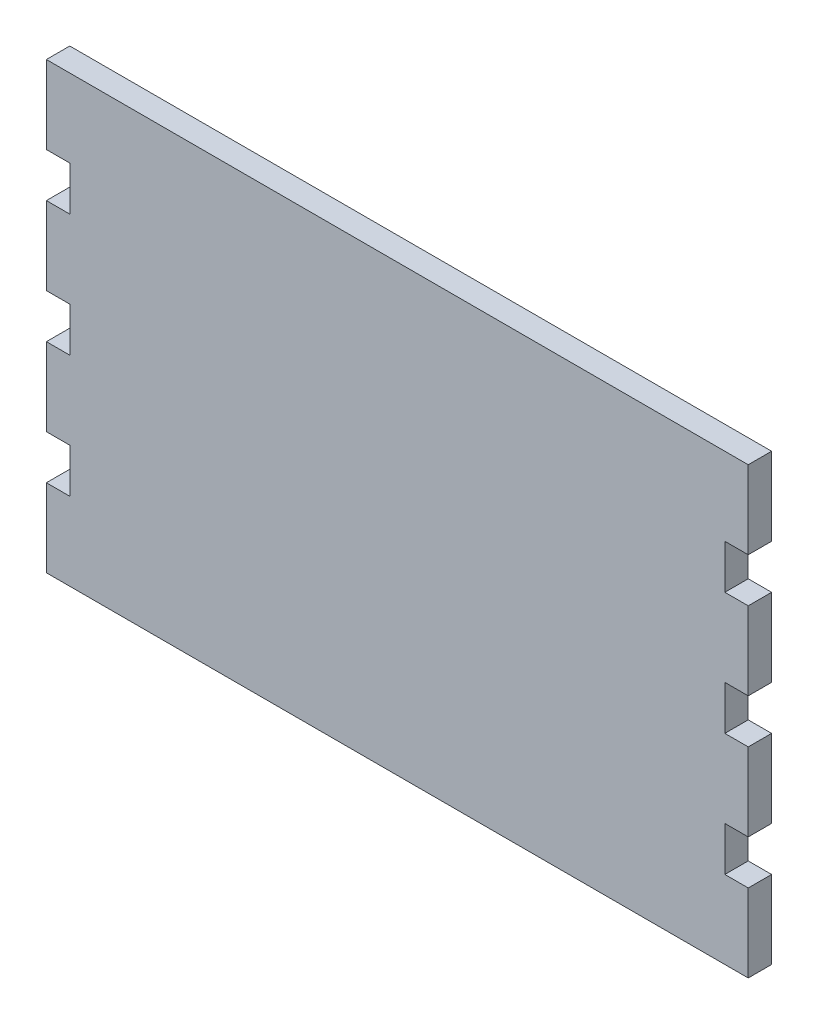
ISO-10303-21;
HEADER;
FILE_DESCRIPTION(('STEP AP214'),'2;1');
FILE_NAME('part.step','',(''),(''),'','','');
FILE_SCHEMA(('AUTOMOTIVE_DESIGN { 1 0 10303 214 1 1 1 1 }'));
ENDSEC;
DATA;
#1=APPLICATION_CONTEXT('core data for automotive mechanical design processes');
#2=APPLICATION_PROTOCOL_DEFINITION('international standard','automotive_design',2000,#1);
#3=PRODUCT_CONTEXT('',#1,'mechanical');
#4=PRODUCT('Part','Part','',(#3));
#5=PRODUCT_RELATED_PRODUCT_CATEGORY('part','',(#4));
#6=PRODUCT_DEFINITION_FORMATION('','',#4);
#7=PRODUCT_DEFINITION_CONTEXT('part definition',#1,'design');
#8=PRODUCT_DEFINITION('design','',#6,#7);
#9=PRODUCT_DEFINITION_SHAPE('','',#8);
#10=(LENGTH_UNIT() NAMED_UNIT(*) SI_UNIT(.MILLI.,.METRE.));
#11=(NAMED_UNIT(*) PLANE_ANGLE_UNIT() SI_UNIT($,.RADIAN.));
#12=(NAMED_UNIT(*) SI_UNIT($,.STERADIAN.) SOLID_ANGLE_UNIT());
#13=UNCERTAINTY_MEASURE_WITH_UNIT(LENGTH_MEASURE(1.E-05),#10,'distance_accuracy_value','');
#14=(GEOMETRIC_REPRESENTATION_CONTEXT(3) GLOBAL_UNCERTAINTY_ASSIGNED_CONTEXT((#13)) GLOBAL_UNIT_ASSIGNED_CONTEXT((#10,
#11,#12)) REPRESENTATION_CONTEXT('',''));
#15=CARTESIAN_POINT('',(0.,0.,0.));
#16=DIRECTION('',(0.,0.,1.));
#17=DIRECTION('',(1.,0.,0.));
#18=AXIS2_PLACEMENT_3D('',#15,#16,#17);
#19=CARTESIAN_POINT('',(0.,0.,-3.));
#20=DIRECTION('',(-1.,0.,0.));
#21=DIRECTION('',(0.,0.,1.));
#22=AXIS2_PLACEMENT_3D('',#19,#20,#21);
#23=PLANE('',#22);
#24=DIRECTION('',(0.,-1.,0.));
#25=VECTOR('',#24,1.);
#26=CARTESIAN_POINT('',(0.,0.,-3.));
#27=LINE('',#26,#25);
#28=CARTESIAN_POINT('',(0.,15.6666666666667,-3.));
#29=VERTEX_POINT('',#28);
#30=CARTESIAN_POINT('',(0.,10.,-3.));
#31=VERTEX_POINT('',#30);
#32=EDGE_CURVE('E269',#29,#31,#27,.T.);
#33=ORIENTED_EDGE('',*,*,#32,.T.);
#34=CARTESIAN_POINT('',(0.,10.,-3.));
#35=CARTESIAN_POINT('',(0.,10.,0.));
#36=B_SPLINE_CURVE_WITH_KNOTS('',1,(#34,#35),.UNSPECIFIED.,.F.,.F.,(2,2),(0.,0.115384615384615),.UNSPECIFIED.);
#37=CARTESIAN_POINT('',(0.,10.,0.));
#38=VERTEX_POINT('',#37);
#39=EDGE_CURVE('E274',#31,#38,#36,.T.);
#40=ORIENTED_EDGE('',*,*,#39,.T.);
#41=DIRECTION('',(0.,-1.,0.));
#42=VECTOR('',#41,1.);
#43=CARTESIAN_POINT('',(0.,0.,0.));
#44=LINE('',#43,#42);
#45=CARTESIAN_POINT('',(0.,15.6666666666667,0.));
#46=VERTEX_POINT('',#45);
#47=EDGE_CURVE('E306',#46,#38,#44,.T.);
#48=ORIENTED_EDGE('',*,*,#47,.F.);
#49=CARTESIAN_POINT('',(0.,15.6666666666667,0.));
#50=CARTESIAN_POINT('',(0.,15.6666666666667,-3.));
#51=B_SPLINE_CURVE_WITH_KNOTS('',1,(#49,#50),.UNSPECIFIED.,.F.,.F.,(2,2),(0.5,
0.615384615384615),.UNSPECIFIED.);
#52=EDGE_CURVE('E280',#46,#29,#51,.T.);
#53=ORIENTED_EDGE('',*,*,#52,.T.);
#54=EDGE_LOOP('',(#33,#40,#48,#53));
#55=FACE_BOUND('',#54,.T.);
#56=ADVANCED_FACE('F74',(#55),#23,.T.);
#57=CARTESIAN_POINT('',(0.,31.3333333333333,-3.));
#58=VERTEX_POINT('',#57);
#59=CARTESIAN_POINT('',(0.,25.6666666666667,-3.));
#60=VERTEX_POINT('',#59);
#61=EDGE_CURVE('E281',#58,#60,#27,.T.);
#62=ORIENTED_EDGE('',*,*,#61,.T.);
#63=CARTESIAN_POINT('',(0.,25.6666666666667,-3.));
#64=CARTESIAN_POINT('',(0.,25.6666666666667,0.));
#65=B_SPLINE_CURVE_WITH_KNOTS('',1,(#63,#64),.UNSPECIFIED.,.F.,.F.,(2,2),(0.,0.115384615384615),.UNSPECIFIED.);
#66=CARTESIAN_POINT('',(0.,25.6666666666667,0.));
#67=VERTEX_POINT('',#66);
#68=EDGE_CURVE('E462',#60,#67,#65,.T.);
#69=ORIENTED_EDGE('',*,*,#68,.T.);
#70=CARTESIAN_POINT('',(0.,31.3333333333333,0.));
#71=VERTEX_POINT('',#70);
#72=EDGE_CURVE('E305',#71,#67,#44,.T.);
#73=ORIENTED_EDGE('',*,*,#72,.F.);
#74=CARTESIAN_POINT('',(0.,31.3333333333333,0.));
#75=CARTESIAN_POINT('',(0.,31.3333333333333,-3.));
#76=B_SPLINE_CURVE_WITH_KNOTS('',1,(#74,#75),.UNSPECIFIED.,.F.,.F.,(2,2),(0.5,
0.615384615384615),.UNSPECIFIED.);
#77=EDGE_CURVE('E508',#71,#58,#76,.T.);
#78=ORIENTED_EDGE('',*,*,#77,.T.);
#79=EDGE_LOOP('',(#62,#69,#73,#78));
#80=FACE_BOUND('',#79,.T.);
#81=ADVANCED_FACE('F592',(#80),#23,.T.);
#82=CARTESIAN_POINT('',(0.,47.,-3.));
#83=VERTEX_POINT('',#82);
#84=CARTESIAN_POINT('',(0.,41.3333333333333,-3.));
#85=VERTEX_POINT('',#84);
#86=EDGE_CURVE('E283',#83,#85,#27,.T.);
#87=ORIENTED_EDGE('',*,*,#86,.T.);
#88=CARTESIAN_POINT('',(0.,41.3333333333333,-3.));
#89=CARTESIAN_POINT('',(0.,41.3333333333333,0.));
#90=B_SPLINE_CURVE_WITH_KNOTS('',1,(#88,#89),.UNSPECIFIED.,.F.,.F.,(2,2),(0.,0.115384615384615),.UNSPECIFIED.);
#91=CARTESIAN_POINT('',(0.,41.3333333333333,0.));
#92=VERTEX_POINT('',#91);
#93=EDGE_CURVE('E496',#85,#92,#90,.T.);
#94=ORIENTED_EDGE('',*,*,#93,.T.);
#95=CARTESIAN_POINT('',(0.,47.,0.));
#96=VERTEX_POINT('',#95);
#97=EDGE_CURVE('E301',#96,#92,#44,.T.);
#98=ORIENTED_EDGE('',*,*,#97,.F.);
#99=CARTESIAN_POINT('',(0.,47.,0.));
#100=CARTESIAN_POINT('',(0.,47.,-3.));
#101=B_SPLINE_CURVE_WITH_KNOTS('',1,(#99,#100),.UNSPECIFIED.,.F.,.F.,(2,2),(0.5,
0.615384615384615),.UNSPECIFIED.);
#102=EDGE_CURVE('E527',#96,#83,#101,.T.);
#103=ORIENTED_EDGE('',*,*,#102,.T.);
#104=EDGE_LOOP('',(#87,#94,#98,#103));
#105=FACE_BOUND('',#104,.T.);
#106=ADVANCED_FACE('F76',(#105),#23,.T.);
#107=CARTESIAN_POINT('',(84.,0.,-3.));
#108=DIRECTION('',(1.,0.,0.));
#109=DIRECTION('',(0.,0.,-1.));
#110=AXIS2_PLACEMENT_3D('',#107,#108,#109);
#111=PLANE('',#110);
#112=CARTESIAN_POINT('',(84.,47.,0.));
#113=CARTESIAN_POINT('',(84.,47.,-3.));
#114=B_SPLINE_CURVE_WITH_KNOTS('',1,(#112,#113),.UNSPECIFIED.,.F.,.F.,(2,2),(0.5,
0.615384615384615),.UNSPECIFIED.);
#115=CARTESIAN_POINT('',(84.,47.,0.));
#116=VERTEX_POINT('',#115);
#117=CARTESIAN_POINT('',(84.,47.,-3.));
#118=VERTEX_POINT('',#117);
#119=EDGE_CURVE('E330',#116,#118,#114,.T.);
#120=ORIENTED_EDGE('',*,*,#119,.F.);
#121=DIRECTION('',(0.,1.,0.));
#122=VECTOR('',#121,1.);
#123=CARTESIAN_POINT('',(84.,0.,0.));
#124=LINE('',#123,#122);
#125=CARTESIAN_POINT('',(84.,41.3333333333333,0.));
#126=VERTEX_POINT('',#125);
#127=EDGE_CURVE('E307',#126,#116,#124,.T.);
#128=ORIENTED_EDGE('',*,*,#127,.F.);
#129=CARTESIAN_POINT('',(84.,41.3333333333333,-3.));
#130=CARTESIAN_POINT('',(84.,41.3333333333333,0.));
#131=B_SPLINE_CURVE_WITH_KNOTS('',1,(#129,#130),.UNSPECIFIED.,.F.,.F.,(2,2),(0.,
0.115384615384615),.UNSPECIFIED.);
#132=CARTESIAN_POINT('',(84.,41.3333333333333,-3.));
#133=VERTEX_POINT('',#132);
#134=EDGE_CURVE('E353',#133,#126,#131,.T.);
#135=ORIENTED_EDGE('',*,*,#134,.F.);
#136=DIRECTION('',(0.,1.,0.));
#137=VECTOR('',#136,1.);
#138=CARTESIAN_POINT('',(84.,0.,-3.));
#139=LINE('',#138,#137);
#140=EDGE_CURVE('E293',#133,#118,#139,.T.);
#141=ORIENTED_EDGE('',*,*,#140,.T.);
#142=EDGE_LOOP('',(#120,#128,#135,#141));
#143=FACE_BOUND('',#142,.T.);
#144=ADVANCED_FACE('F617',(#143),#111,.T.);
#145=CARTESIAN_POINT('',(84.,31.3333333333333,0.));
#146=CARTESIAN_POINT('',(84.,31.3333333333333,-3.));
#147=B_SPLINE_CURVE_WITH_KNOTS('',1,(#145,#146),.UNSPECIFIED.,.F.,.F.,(2,2),(0.5,
0.615384615384615),.UNSPECIFIED.);
#148=CARTESIAN_POINT('',(84.,31.3333333333333,0.));
#149=VERTEX_POINT('',#148);
#150=CARTESIAN_POINT('',(84.,31.3333333333333,-3.));
#151=VERTEX_POINT('',#150);
#152=EDGE_CURVE('E346',#149,#151,#147,.T.);
#153=ORIENTED_EDGE('',*,*,#152,.F.);
#154=CARTESIAN_POINT('',(84.,25.6666666666667,0.));
#155=VERTEX_POINT('',#154);
#156=EDGE_CURVE('E309',#155,#149,#124,.T.);
#157=ORIENTED_EDGE('',*,*,#156,.F.);
#158=CARTESIAN_POINT('',(84.,25.6666666666667,-3.));
#159=CARTESIAN_POINT('',(84.,25.6666666666667,0.));
#160=B_SPLINE_CURVE_WITH_KNOTS('',1,(#158,#159),.UNSPECIFIED.,.F.,.F.,(2,2),(0.,
0.115384615384615),.UNSPECIFIED.);
#161=CARTESIAN_POINT('',(84.,25.6666666666667,-3.));
#162=VERTEX_POINT('',#161);
#163=EDGE_CURVE('E391',#162,#155,#160,.T.);
#164=ORIENTED_EDGE('',*,*,#163,.F.);
#165=EDGE_CURVE('E298',#162,#151,#139,.T.);
#166=ORIENTED_EDGE('',*,*,#165,.T.);
#167=EDGE_LOOP('',(#153,#157,#164,#166));
#168=FACE_BOUND('',#167,.T.);
#169=ADVANCED_FACE('F622',(#168),#111,.T.);
#170=CARTESIAN_POINT('',(0.,57.,-3.));
#171=DIRECTION('',(0.,1.,0.));
#172=DIRECTION('',(0.,0.,1.));
#173=AXIS2_PLACEMENT_3D('',#170,#171,#172);
#174=PLANE('',#173);
#175=DIRECTION('',(-1.,0.,0.));
#176=VECTOR('',#175,1.);
#177=CARTESIAN_POINT('',(0.,57.,0.));
#178=LINE('',#177,#176);
#179=CARTESIAN_POINT('',(87.,57.,0.));
#180=VERTEX_POINT('',#179);
#181=CARTESIAN_POINT('',(-2.99999999999948,57.,0.));
#182=VERTEX_POINT('',#181);
#183=EDGE_CURVE('E78',#180,#182,#178,.T.);
#184=ORIENTED_EDGE('',*,*,#183,.F.);
#185=DIRECTION('',(0.,0.,1.));
#186=VECTOR('',#185,1.);
#187=CARTESIAN_POINT('',(87.,57.,-3.));
#188=LINE('',#187,#186);
#189=CARTESIAN_POINT('',(87.,57.,-3.));
#190=VERTEX_POINT('',#189);
#191=EDGE_CURVE('E551',#190,#180,#188,.T.);
#192=ORIENTED_EDGE('',*,*,#191,.F.);
#193=DIRECTION('',(-1.,0.,0.));
#194=VECTOR('',#193,1.);
#195=CARTESIAN_POINT('',(0.,57.,-3.));
#196=LINE('',#195,#194);
#197=CARTESIAN_POINT('',(-2.99999999999949,57.,-3.));
#198=VERTEX_POINT('',#197);
#199=EDGE_CURVE('E13',#190,#198,#196,.T.);
#200=ORIENTED_EDGE('',*,*,#199,.T.);
#201=DIRECTION('',(0.,0.,-1.));
#202=VECTOR('',#201,1.);
#203=CARTESIAN_POINT('',(-2.99999999999949,57.,-3.00000000000001));
#204=LINE('',#203,#202);
#205=EDGE_CURVE('E338',#182,#198,#204,.T.);
#206=ORIENTED_EDGE('',*,*,#205,.F.);
#207=EDGE_LOOP('',(#184,#192,#200,#206));
#208=FACE_BOUND('',#207,.T.);
#209=ADVANCED_FACE('F563',(#208),#174,.T.);
#210=CARTESIAN_POINT('',(84.,15.6666666666667,0.));
#211=CARTESIAN_POINT('',(84.,15.6666666666667,-3.));
#212=B_SPLINE_CURVE_WITH_KNOTS('',1,(#210,#211),.UNSPECIFIED.,.F.,.F.,(2,2),(0.5,
0.615384615384615),.UNSPECIFIED.);
#213=CARTESIAN_POINT('',(84.,15.6666666666667,0.));
#214=VERTEX_POINT('',#213);
#215=CARTESIAN_POINT('',(84.,15.6666666666667,-3.));
#216=VERTEX_POINT('',#215);
#217=EDGE_CURVE('E384',#214,#216,#212,.T.);
#218=ORIENTED_EDGE('',*,*,#217,.F.);
#219=CARTESIAN_POINT('',(84.,10.,0.));
#220=VERTEX_POINT('',#219);
#221=EDGE_CURVE('E285',#220,#214,#124,.T.);
#222=ORIENTED_EDGE('',*,*,#221,.F.);
#223=CARTESIAN_POINT('',(84.,10.,-3.));
#224=CARTESIAN_POINT('',(84.,10.,0.));
#225=B_SPLINE_CURVE_WITH_KNOTS('',1,(#223,#224),.UNSPECIFIED.,.F.,.F.,(2,2),(0.,
0.115384615384615),.UNSPECIFIED.);
#226=CARTESIAN_POINT('',(84.,10.,-3.));
#227=VERTEX_POINT('',#226);
#228=EDGE_CURVE('E423',#227,#220,#225,.T.);
#229=ORIENTED_EDGE('',*,*,#228,.F.);
#230=EDGE_CURVE('E83',#227,#216,#139,.T.);
#231=ORIENTED_EDGE('',*,*,#230,.T.);
#232=EDGE_LOOP('',(#218,#222,#229,#231));
#233=FACE_BOUND('',#232,.T.);
#234=ADVANCED_FACE('F452',(#233),#111,.T.);
#235=CARTESIAN_POINT('',(0.,0.,-3.));
#236=DIRECTION('',(0.,-1.,0.));
#237=DIRECTION('',(0.,0.,-1.));
#238=AXIS2_PLACEMENT_3D('',#235,#236,#237);
#239=PLANE('',#238);
#240=DIRECTION('',(1.,0.,0.));
#241=VECTOR('',#240,1.);
#242=CARTESIAN_POINT('',(0.,0.,0.));
#243=LINE('',#242,#241);
#244=CARTESIAN_POINT('',(-2.99999999999984,0.,0.));
#245=VERTEX_POINT('',#244);
#246=CARTESIAN_POINT('',(87.,0.,0.));
#247=VERTEX_POINT('',#246);
#248=EDGE_CURVE('E304',#245,#247,#243,.T.);
#249=ORIENTED_EDGE('',*,*,#248,.F.);
#250=DIRECTION('',(0.,0.,1.));
#251=VECTOR('',#250,1.);
#252=CARTESIAN_POINT('',(-2.99999999999988,0.,0.));
#253=LINE('',#252,#251);
#254=CARTESIAN_POINT('',(-2.99999999999989,0.,-3.));
#255=VERTEX_POINT('',#254);
#256=EDGE_CURVE('E272',#255,#245,#253,.T.);
#257=ORIENTED_EDGE('',*,*,#256,.F.);
#258=DIRECTION('',(1.,0.,0.));
#259=VECTOR('',#258,1.);
#260=CARTESIAN_POINT('',(0.,0.,-3.));
#261=LINE('',#260,#259);
#262=CARTESIAN_POINT('',(87.,0.,-3.));
#263=VERTEX_POINT('',#262);
#264=EDGE_CURVE('E289',#255,#263,#261,.T.);
#265=ORIENTED_EDGE('',*,*,#264,.T.);
#266=DIRECTION('',(0.,0.,-1.));
#267=VECTOR('',#266,1.);
#268=CARTESIAN_POINT('',(87.,0.,0.));
#269=LINE('',#268,#267);
#270=EDGE_CURVE('E429',#247,#263,#269,.T.);
#271=ORIENTED_EDGE('',*,*,#270,.F.);
#272=EDGE_LOOP('',(#249,#257,#265,#271));
#273=FACE_BOUND('',#272,.T.);
#274=ADVANCED_FACE('F455',(#273),#239,.T.);
#275=CARTESIAN_POINT('',(0.,0.,-3.));
#276=DIRECTION('',(0.,0.,-1.));
#277=DIRECTION('',(-1.,0.,0.));
#278=AXIS2_PLACEMENT_3D('',#275,#276,#277);
#279=PLANE('',#278);
#280=ORIENTED_EDGE('',*,*,#86,.F.);
#281=DIRECTION('',(1.,0.,0.));
#282=VECTOR('',#281,1.);
#283=CARTESIAN_POINT('',(-5.99999999999901,47.,-3.));
#284=LINE('',#283,#282);
#285=CARTESIAN_POINT('',(-2.99999999999956,47.,-3.));
#286=VERTEX_POINT('',#285);
#287=EDGE_CURVE('E531',#286,#83,#284,.T.);
#288=ORIENTED_EDGE('',*,*,#287,.F.);
#289=DIRECTION('',(0.,-1.,0.));
#290=VECTOR('',#289,1.);
#291=CARTESIAN_POINT('',(-2.99999999999956,47.,-3.));
#292=LINE('',#291,#290);
#293=EDGE_CURVE('E530',#198,#286,#292,.T.);
#294=ORIENTED_EDGE('',*,*,#293,.F.);
#295=ORIENTED_EDGE('',*,*,#199,.F.);
#296=DIRECTION('',(0.,1.,0.));
#297=VECTOR('',#296,1.);
#298=CARTESIAN_POINT('',(87.,47.,-3.));
#299=LINE('',#298,#297);
#300=CARTESIAN_POINT('',(87.,47.,-3.));
#301=VERTEX_POINT('',#300);
#302=EDGE_CURVE('E342',#301,#190,#299,.T.);
#303=ORIENTED_EDGE('',*,*,#302,.F.);
#304=DIRECTION('',(-1.,0.,0.));
#305=VECTOR('',#304,1.);
#306=CARTESIAN_POINT('',(90.,47.,-3.));
#307=LINE('',#306,#305);
#308=EDGE_CURVE('E335',#301,#118,#307,.T.);
#309=ORIENTED_EDGE('',*,*,#308,.T.);
#310=ORIENTED_EDGE('',*,*,#140,.F.);
#311=DIRECTION('',(-1.,0.,0.));
#312=VECTOR('',#311,1.);
#313=CARTESIAN_POINT('',(90.,41.3333333333333,-3.));
#314=LINE('',#313,#312);
#315=CARTESIAN_POINT('',(87.,41.3333333333333,-3.));
#316=VERTEX_POINT('',#315);
#317=EDGE_CURVE('E360',#316,#133,#314,.T.);
#318=ORIENTED_EDGE('',*,*,#317,.F.);
#319=DIRECTION('',(0.,1.,0.));
#320=VECTOR('',#319,1.);
#321=CARTESIAN_POINT('',(87.,31.3333333333333,-3.));
#322=LINE('',#321,#320);
#323=CARTESIAN_POINT('',(87.,31.3333333333333,-3.));
#324=VERTEX_POINT('',#323);
#325=EDGE_CURVE('E374',#324,#316,#322,.T.);
#326=ORIENTED_EDGE('',*,*,#325,.F.);
#327=DIRECTION('',(-1.,0.,0.));
#328=VECTOR('',#327,1.);
#329=CARTESIAN_POINT('',(90.,31.3333333333333,-3.));
#330=LINE('',#329,#328);
#331=EDGE_CURVE('E351',#324,#151,#330,.T.);
#332=ORIENTED_EDGE('',*,*,#331,.T.);
#333=ORIENTED_EDGE('',*,*,#165,.F.);
#334=DIRECTION('',(-1.,0.,0.));
#335=VECTOR('',#334,1.);
#336=CARTESIAN_POINT('',(90.,25.6666666666667,-3.));
#337=LINE('',#336,#335);
#338=CARTESIAN_POINT('',(87.,25.6666666666667,-3.));
#339=VERTEX_POINT('',#338);
#340=EDGE_CURVE('E367',#339,#162,#337,.T.);
#341=ORIENTED_EDGE('',*,*,#340,.F.);
#342=DIRECTION('',(0.,1.,0.));
#343=VECTOR('',#342,1.);
#344=CARTESIAN_POINT('',(87.,15.6666666666667,-3.));
#345=LINE('',#344,#343);
#346=CARTESIAN_POINT('',(87.,15.6666666666667,-3.));
#347=VERTEX_POINT('',#346);
#348=EDGE_CURVE('E413',#347,#339,#345,.T.);
#349=ORIENTED_EDGE('',*,*,#348,.F.);
#350=DIRECTION('',(-1.,0.,0.));
#351=VECTOR('',#350,1.);
#352=CARTESIAN_POINT('',(90.,15.6666666666667,-3.));
#353=LINE('',#352,#351);
#354=EDGE_CURVE('E389',#347,#216,#353,.T.);
#355=ORIENTED_EDGE('',*,*,#354,.T.);
#356=ORIENTED_EDGE('',*,*,#230,.F.);
#357=DIRECTION('',(-1.,0.,0.));
#358=VECTOR('',#357,1.);
#359=CARTESIAN_POINT('',(90.,10.,-3.));
#360=LINE('',#359,#358);
#361=CARTESIAN_POINT('',(87.,10.,-3.));
#362=VERTEX_POINT('',#361);
#363=EDGE_CURVE('E406',#362,#227,#360,.T.);
#364=ORIENTED_EDGE('',*,*,#363,.F.);
#365=DIRECTION('',(0.,1.,0.));
#366=VECTOR('',#365,1.);
#367=CARTESIAN_POINT('',(87.,0.,-3.));
#368=LINE('',#367,#366);
#369=EDGE_CURVE('E441',#263,#362,#368,.T.);
#370=ORIENTED_EDGE('',*,*,#369,.F.);
#371=ORIENTED_EDGE('',*,*,#264,.F.);
#372=DIRECTION('',(0.,-1.,0.));
#373=VECTOR('',#372,1.);
#374=CARTESIAN_POINT('',(-2.99999999999989,0.,-3.));
#375=LINE('',#374,#373);
#376=CARTESIAN_POINT('',(-2.99999999999982,10.,-3.));
#377=VERTEX_POINT('',#376);
#378=EDGE_CURVE('E271',#377,#255,#375,.T.);
#379=ORIENTED_EDGE('',*,*,#378,.F.);
#380=DIRECTION('',(1.,0.,0.));
#381=VECTOR('',#380,1.);
#382=CARTESIAN_POINT('',(-5.99999999999967,10.,-3.));
#383=LINE('',#382,#381);
#384=EDGE_CURVE('E265',#377,#31,#383,.T.);
#385=ORIENTED_EDGE('',*,*,#384,.T.);
#386=ORIENTED_EDGE('',*,*,#32,.F.);
#387=DIRECTION('',(1.,0.,0.));
#388=VECTOR('',#387,1.);
#389=CARTESIAN_POINT('',(-5.99999999999945,15.6666666666667,-3.));
#390=LINE('',#389,#388);
#391=CARTESIAN_POINT('',(-2.99999999999978,15.6666666666667,-3.));
#392=VERTEX_POINT('',#391);
#393=EDGE_CURVE('E99',#392,#29,#390,.T.);
#394=ORIENTED_EDGE('',*,*,#393,.F.);
#395=DIRECTION('',(0.,-1.,0.));
#396=VECTOR('',#395,1.);
#397=CARTESIAN_POINT('',(-2.99999999999978,15.6666666666667,-3.));
#398=LINE('',#397,#396);
#399=CARTESIAN_POINT('',(-2.99999999999971,25.6666666666667,-3.));
#400=VERTEX_POINT('',#399);
#401=EDGE_CURVE('E472',#400,#392,#398,.T.);
#402=ORIENTED_EDGE('',*,*,#401,.F.);
#403=DIRECTION('',(1.,0.,0.));
#404=VECTOR('',#403,1.);
#405=CARTESIAN_POINT('',(-5.99999999999945,25.6666666666667,-3.));
#406=LINE('',#405,#404);
#407=EDGE_CURVE('E473',#400,#60,#406,.T.);
#408=ORIENTED_EDGE('',*,*,#407,.T.);
#409=ORIENTED_EDGE('',*,*,#61,.F.);
#410=DIRECTION('',(1.,0.,0.));
#411=VECTOR('',#410,1.);
#412=CARTESIAN_POINT('',(-5.99999999999923,31.3333333333333,-3.));
#413=LINE('',#412,#411);
#414=CARTESIAN_POINT('',(-2.99999999999967,31.3333333333333,-3.));
#415=VERTEX_POINT('',#414);
#416=EDGE_CURVE('E521',#415,#58,#413,.T.);
#417=ORIENTED_EDGE('',*,*,#416,.F.);
#418=DIRECTION('',(0.,-1.,0.));
#419=VECTOR('',#418,1.);
#420=CARTESIAN_POINT('',(-2.99999999999967,31.3333333333333,-3.));
#421=LINE('',#420,#419);
#422=CARTESIAN_POINT('',(-2.9999999999996,41.3333333333333,-3.));
#423=VERTEX_POINT('',#422);
#424=EDGE_CURVE('E499',#423,#415,#421,.T.);
#425=ORIENTED_EDGE('',*,*,#424,.F.);
#426=DIRECTION('',(1.,0.,0.));
#427=VECTOR('',#426,1.);
#428=CARTESIAN_POINT('',(-5.99999999999923,41.3333333333333,-3.));
#429=LINE('',#428,#427);
#430=EDGE_CURVE('E500',#423,#85,#429,.T.);
#431=ORIENTED_EDGE('',*,*,#430,.T.);
#432=EDGE_LOOP('',(#280,#288,#294,#295,#303,#309,#310,#318,#326,#332,#333,#341,#349,#355,#356,
#364,#370,#371,#379,#385,#386,#394,#402,#408,#409,#417,#425,#431));
#433=FACE_BOUND('',#432,.T.);
#434=ADVANCED_FACE('F267',(#433),#279,.T.);
#435=CARTESIAN_POINT('',(0.,0.,0.));
#436=DIRECTION('',(0.,0.,-1.));
#437=DIRECTION('',(-1.,0.,0.));
#438=AXIS2_PLACEMENT_3D('',#435,#436,#437);
#439=PLANE('',#438);
#440=ORIENTED_EDGE('',*,*,#183,.T.);
#441=DIRECTION('',(0.,1.,0.));
#442=VECTOR('',#441,1.);
#443=CARTESIAN_POINT('',(-2.99999999999948,57.,0.));
#444=LINE('',#443,#442);
#445=CARTESIAN_POINT('',(-2.99999999999951,47.,0.));
#446=VERTEX_POINT('',#445);
#447=EDGE_CURVE('E333',#446,#182,#444,.T.);
#448=ORIENTED_EDGE('',*,*,#447,.F.);
#449=DIRECTION('',(1.,0.,0.));
#450=VECTOR('',#449,1.);
#451=CARTESIAN_POINT('',(-5.99999999999901,47.,0.));
#452=LINE('',#451,#450);
#453=EDGE_CURVE('E538',#446,#96,#452,.T.);
#454=ORIENTED_EDGE('',*,*,#453,.T.);
#455=ORIENTED_EDGE('',*,*,#97,.T.);
#456=DIRECTION('',(1.,0.,0.));
#457=VECTOR('',#456,1.);
#458=CARTESIAN_POINT('',(-5.99999999999923,41.3333333333333,0.));
#459=LINE('',#458,#457);
#460=CARTESIAN_POINT('',(-2.99999999999959,41.3333333333333,0.));
#461=VERTEX_POINT('',#460);
#462=EDGE_CURVE('E516',#461,#92,#459,.T.);
#463=ORIENTED_EDGE('',*,*,#462,.F.);
#464=DIRECTION('',(0.,1.,0.));
#465=VECTOR('',#464,1.);
#466=CARTESIAN_POINT('',(-2.99999999999959,41.3333333333333,0.));
#467=LINE('',#466,#465);
#468=CARTESIAN_POINT('',(-2.99999999999962,31.3333333333333,0.));
#469=VERTEX_POINT('',#468);
#470=EDGE_CURVE('E504',#469,#461,#467,.T.);
#471=ORIENTED_EDGE('',*,*,#470,.F.);
#472=DIRECTION('',(1.,0.,0.));
#473=VECTOR('',#472,1.);
#474=CARTESIAN_POINT('',(-5.99999999999923,31.3333333333333,0.));
#475=LINE('',#474,#473);
#476=EDGE_CURVE('E523',#469,#71,#475,.T.);
#477=ORIENTED_EDGE('',*,*,#476,.T.);
#478=ORIENTED_EDGE('',*,*,#72,.T.);
#479=DIRECTION('',(1.,0.,0.));
#480=VECTOR('',#479,1.);
#481=CARTESIAN_POINT('',(-5.99999999999945,25.6666666666667,0.));
#482=LINE('',#481,#480);
#483=CARTESIAN_POINT('',(-2.9999999999997,25.6666666666667,0.));
#484=VERTEX_POINT('',#483);
#485=EDGE_CURVE('E486',#484,#67,#482,.T.);
#486=ORIENTED_EDGE('',*,*,#485,.F.);
#487=DIRECTION('',(0.,1.,0.));
#488=VECTOR('',#487,1.);
#489=CARTESIAN_POINT('',(-2.9999999999997,25.6666666666667,0.));
#490=LINE('',#489,#488);
#491=CARTESIAN_POINT('',(-2.99999999999973,15.6666666666667,0.));
#492=VERTEX_POINT('',#491);
#493=EDGE_CURVE('E476',#492,#484,#490,.T.);
#494=ORIENTED_EDGE('',*,*,#493,.F.);
#495=DIRECTION('',(1.,0.,0.));
#496=VECTOR('',#495,1.);
#497=CARTESIAN_POINT('',(-5.99999999999945,15.6666666666667,0.));
#498=LINE('',#497,#496);
#499=EDGE_CURVE('E492',#492,#46,#498,.T.);
#500=ORIENTED_EDGE('',*,*,#499,.T.);
#501=ORIENTED_EDGE('',*,*,#47,.T.);
#502=DIRECTION('',(1.,0.,0.));
#503=VECTOR('',#502,1.);
#504=CARTESIAN_POINT('',(-5.99999999999967,10.,0.));
#505=LINE('',#504,#503);
#506=CARTESIAN_POINT('',(-2.99999999999981,10.,0.));
#507=VERTEX_POINT('',#506);
#508=EDGE_CURVE('E91',#507,#38,#505,.T.);
#509=ORIENTED_EDGE('',*,*,#508,.F.);
#510=DIRECTION('',(0.,1.,0.));
#511=VECTOR('',#510,1.);
#512=CARTESIAN_POINT('',(-2.99999999999981,9.99999999999999,0.));
#513=LINE('',#512,#511);
#514=EDGE_CURVE('E460',#245,#507,#513,.T.);
#515=ORIENTED_EDGE('',*,*,#514,.F.);
#516=ORIENTED_EDGE('',*,*,#248,.T.);
#517=DIRECTION('',(0.,-1.,0.));
#518=VECTOR('',#517,1.);
#519=CARTESIAN_POINT('',(87.,10.,0.));
#520=LINE('',#519,#518);
#521=CARTESIAN_POINT('',(87.,10.,0.));
#522=VERTEX_POINT('',#521);
#523=EDGE_CURVE('E435',#522,#247,#520,.T.);
#524=ORIENTED_EDGE('',*,*,#523,.F.);
#525=DIRECTION('',(-1.,0.,0.));
#526=VECTOR('',#525,1.);
#527=CARTESIAN_POINT('',(90.,10.,0.));
#528=LINE('',#527,#526);
#529=EDGE_CURVE('E428',#522,#220,#528,.T.);
#530=ORIENTED_EDGE('',*,*,#529,.T.);
#531=ORIENTED_EDGE('',*,*,#221,.T.);
#532=DIRECTION('',(-1.,0.,0.));
#533=VECTOR('',#532,1.);
#534=CARTESIAN_POINT('',(90.,15.6666666666667,0.));
#535=LINE('',#534,#533);
#536=CARTESIAN_POINT('',(87.,15.6666666666667,0.));
#537=VERTEX_POINT('',#536);
#538=EDGE_CURVE('E390',#537,#214,#535,.T.);
#539=ORIENTED_EDGE('',*,*,#538,.F.);
#540=DIRECTION('',(0.,-1.,0.));
#541=VECTOR('',#540,1.);
#542=CARTESIAN_POINT('',(87.,25.6666666666667,0.));
#543=LINE('',#542,#541);
#544=CARTESIAN_POINT('',(87.,25.6666666666667,0.));
#545=VERTEX_POINT('',#544);
#546=EDGE_CURVE('E407',#545,#537,#543,.T.);
#547=ORIENTED_EDGE('',*,*,#546,.F.);
#548=DIRECTION('',(-1.,0.,0.));
#549=VECTOR('',#548,1.);
#550=CARTESIAN_POINT('',(90.,25.6666666666667,0.));
#551=LINE('',#550,#549);
#552=EDGE_CURVE('E399',#545,#155,#551,.T.);
#553=ORIENTED_EDGE('',*,*,#552,.T.);
#554=ORIENTED_EDGE('',*,*,#156,.T.);
#555=DIRECTION('',(-1.,0.,0.));
#556=VECTOR('',#555,1.);
#557=CARTESIAN_POINT('',(90.,31.3333333333333,0.));
#558=LINE('',#557,#556);
#559=CARTESIAN_POINT('',(87.,31.3333333333333,0.));
#560=VERTEX_POINT('',#559);
#561=EDGE_CURVE('E352',#560,#149,#558,.T.);
#562=ORIENTED_EDGE('',*,*,#561,.F.);
#563=DIRECTION('',(0.,-1.,0.));
#564=VECTOR('',#563,1.);
#565=CARTESIAN_POINT('',(87.,41.3333333333333,0.));
#566=LINE('',#565,#564);
#567=CARTESIAN_POINT('',(87.,41.3333333333333,0.));
#568=VERTEX_POINT('',#567);
#569=EDGE_CURVE('E368',#568,#560,#566,.T.);
#570=ORIENTED_EDGE('',*,*,#569,.F.);
#571=DIRECTION('',(-1.,0.,0.));
#572=VECTOR('',#571,1.);
#573=CARTESIAN_POINT('',(90.,41.3333333333333,0.));
#574=LINE('',#573,#572);
#575=EDGE_CURVE('E324',#568,#126,#574,.T.);
#576=ORIENTED_EDGE('',*,*,#575,.T.);
#577=ORIENTED_EDGE('',*,*,#127,.T.);
#578=DIRECTION('',(-1.,0.,0.));
#579=VECTOR('',#578,1.);
#580=CARTESIAN_POINT('',(90.,47.,0.));
#581=LINE('',#580,#579);
#582=CARTESIAN_POINT('',(87.,47.,0.));
#583=VERTEX_POINT('',#582);
#584=EDGE_CURVE('E321',#583,#116,#581,.T.);
#585=ORIENTED_EDGE('',*,*,#584,.F.);
#586=DIRECTION('',(0.,-1.,0.));
#587=VECTOR('',#586,1.);
#588=CARTESIAN_POINT('',(87.,57.,0.));
#589=LINE('',#588,#587);
#590=EDGE_CURVE('E550',#180,#583,#589,.T.);
#591=ORIENTED_EDGE('',*,*,#590,.F.);
#592=EDGE_LOOP('',(#440,#448,#454,#455,#463,#471,#477,#478,#486,#494,#500,#501,#509,#515,#516,
#524,#530,#531,#539,#547,#553,#554,#562,#570,#576,#577,#585,#591));
#593=FACE_BOUND('',#592,.T.);
#594=ADVANCED_FACE('F319',(#593),#439,.F.);
#595=CARTESIAN_POINT('',(90.,10.,-3.));
#596=DIRECTION('',(0.,-1.,0.));
#597=DIRECTION('',(0.,0.,-1.));
#598=AXIS2_PLACEMENT_3D('',#595,#596,#597);
#599=PLANE('',#598);
#600=DIRECTION('',(0.,0.,1.));
#601=VECTOR('',#600,1.);
#602=CARTESIAN_POINT('',(87.,10.,-3.));
#603=LINE('',#602,#601);
#604=EDGE_CURVE('E438',#362,#522,#603,.T.);
#605=ORIENTED_EDGE('',*,*,#604,.F.);
#606=ORIENTED_EDGE('',*,*,#363,.T.);
#607=ORIENTED_EDGE('',*,*,#228,.T.);
#608=ORIENTED_EDGE('',*,*,#529,.F.);
#609=EDGE_LOOP('',(#605,#606,#607,#608));
#610=FACE_BOUND('',#609,.T.);
#611=ADVANCED_FACE('F447',(#610),#599,.F.);
#612=CARTESIAN_POINT('',(87.,57.0000000000003,-27.0000000000001));
#613=DIRECTION('',(1.,0.,0.));
#614=DIRECTION('',(0.,1.,0.));
#615=AXIS2_PLACEMENT_3D('',#612,#613,#614);
#616=PLANE('',#615);
#617=ORIENTED_EDGE('',*,*,#369,.T.);
#618=ORIENTED_EDGE('',*,*,#604,.T.);
#619=ORIENTED_EDGE('',*,*,#523,.T.);
#620=ORIENTED_EDGE('',*,*,#270,.T.);
#621=EDGE_LOOP('',(#617,#618,#619,#620));
#622=FACE_BOUND('',#621,.T.);
#623=ADVANCED_FACE('F454',(#622),#616,.T.);
#624=CARTESIAN_POINT('',(90.,25.6666666666667,-3.));
#625=DIRECTION('',(0.,-1.,0.));
#626=DIRECTION('',(0.,0.,-1.));
#627=AXIS2_PLACEMENT_3D('',#624,#625,#626);
#628=PLANE('',#627);
#629=DIRECTION('',(0.,0.,1.));
#630=VECTOR('',#629,1.);
#631=CARTESIAN_POINT('',(87.,25.6666666666667,-3.));
#632=LINE('',#631,#630);
#633=EDGE_CURVE('E410',#339,#545,#632,.T.);
#634=ORIENTED_EDGE('',*,*,#633,.F.);
#635=ORIENTED_EDGE('',*,*,#340,.T.);
#636=ORIENTED_EDGE('',*,*,#163,.T.);
#637=ORIENTED_EDGE('',*,*,#552,.F.);
#638=EDGE_LOOP('',(#634,#635,#636,#637));
#639=FACE_BOUND('',#638,.T.);
#640=ADVANCED_FACE('F643',(#639),#628,.F.);
#641=CARTESIAN_POINT('',(90.,15.6666666666667,0.));
#642=DIRECTION('',(0.,1.,0.));
#643=DIRECTION('',(0.,0.,1.));
#644=AXIS2_PLACEMENT_3D('',#641,#642,#643);
#645=PLANE('',#644);
#646=DIRECTION('',(0.,0.,-1.));
#647=VECTOR('',#646,1.);
#648=CARTESIAN_POINT('',(87.,15.6666666666667,0.));
#649=LINE('',#648,#647);
#650=EDGE_CURVE('E400',#537,#347,#649,.T.);
#651=ORIENTED_EDGE('',*,*,#650,.F.);
#652=ORIENTED_EDGE('',*,*,#538,.T.);
#653=ORIENTED_EDGE('',*,*,#217,.T.);
#654=ORIENTED_EDGE('',*,*,#354,.F.);
#655=EDGE_LOOP('',(#651,#652,#653,#654));
#656=FACE_BOUND('',#655,.T.);
#657=ADVANCED_FACE('F650',(#656),#645,.F.);
#658=CARTESIAN_POINT('',(87.,57.0000000000003,-27.0000000000001));
#659=DIRECTION('',(1.,0.,0.));
#660=DIRECTION('',(0.,1.,0.));
#661=AXIS2_PLACEMENT_3D('',#658,#659,#660);
#662=PLANE('',#661);
#663=ORIENTED_EDGE('',*,*,#348,.T.);
#664=ORIENTED_EDGE('',*,*,#633,.T.);
#665=ORIENTED_EDGE('',*,*,#546,.T.);
#666=ORIENTED_EDGE('',*,*,#650,.T.);
#667=EDGE_LOOP('',(#663,#664,#665,#666));
#668=FACE_BOUND('',#667,.T.);
#669=ADVANCED_FACE('F646',(#668),#662,.T.);
#670=CARTESIAN_POINT('',(90.,41.3333333333333,-3.));
#671=DIRECTION('',(0.,-1.,0.));
#672=DIRECTION('',(0.,0.,-1.));
#673=AXIS2_PLACEMENT_3D('',#670,#671,#672);
#674=PLANE('',#673);
#675=DIRECTION('',(0.,0.,1.));
#676=VECTOR('',#675,1.);
#677=CARTESIAN_POINT('',(87.,41.3333333333333,-3.));
#678=LINE('',#677,#676);
#679=EDGE_CURVE('E371',#316,#568,#678,.T.);
#680=ORIENTED_EDGE('',*,*,#679,.F.);
#681=ORIENTED_EDGE('',*,*,#317,.T.);
#682=ORIENTED_EDGE('',*,*,#134,.T.);
#683=ORIENTED_EDGE('',*,*,#575,.F.);
#684=EDGE_LOOP('',(#680,#681,#682,#683));
#685=FACE_BOUND('',#684,.T.);
#686=ADVANCED_FACE('F649',(#685),#674,.F.);
#687=CARTESIAN_POINT('',(90.,31.3333333333333,0.));
#688=DIRECTION('',(0.,1.,0.));
#689=DIRECTION('',(0.,0.,1.));
#690=AXIS2_PLACEMENT_3D('',#687,#688,#689);
#691=PLANE('',#690);
#692=DIRECTION('',(0.,0.,-1.));
#693=VECTOR('',#692,1.);
#694=CARTESIAN_POINT('',(87.,31.3333333333333,0.));
#695=LINE('',#694,#693);
#696=EDGE_CURVE('E361',#560,#324,#695,.T.);
#697=ORIENTED_EDGE('',*,*,#696,.F.);
#698=ORIENTED_EDGE('',*,*,#561,.T.);
#699=ORIENTED_EDGE('',*,*,#152,.T.);
#700=ORIENTED_EDGE('',*,*,#331,.F.);
#701=EDGE_LOOP('',(#697,#698,#699,#700));
#702=FACE_BOUND('',#701,.T.);
#703=ADVANCED_FACE('F661',(#702),#691,.F.);
#704=CARTESIAN_POINT('',(87.,57.0000000000003,-27.0000000000001));
#705=DIRECTION('',(1.,0.,0.));
#706=DIRECTION('',(0.,1.,0.));
#707=AXIS2_PLACEMENT_3D('',#704,#705,#706);
#708=PLANE('',#707);
#709=ORIENTED_EDGE('',*,*,#325,.T.);
#710=ORIENTED_EDGE('',*,*,#679,.T.);
#711=ORIENTED_EDGE('',*,*,#569,.T.);
#712=ORIENTED_EDGE('',*,*,#696,.T.);
#713=EDGE_LOOP('',(#709,#710,#711,#712));
#714=FACE_BOUND('',#713,.T.);
#715=ADVANCED_FACE('F658',(#714),#708,.T.);
#716=CARTESIAN_POINT('',(90.,47.,0.));
#717=DIRECTION('',(0.,1.,0.));
#718=DIRECTION('',(0.,0.,1.));
#719=AXIS2_PLACEMENT_3D('',#716,#717,#718);
#720=PLANE('',#719);
#721=DIRECTION('',(0.,0.,-1.));
#722=VECTOR('',#721,1.);
#723=CARTESIAN_POINT('',(87.,47.,0.));
#724=LINE('',#723,#722);
#725=EDGE_CURVE('E332',#583,#301,#724,.T.);
#726=ORIENTED_EDGE('',*,*,#725,.F.);
#727=ORIENTED_EDGE('',*,*,#584,.T.);
#728=ORIENTED_EDGE('',*,*,#119,.T.);
#729=ORIENTED_EDGE('',*,*,#308,.F.);
#730=EDGE_LOOP('',(#726,#727,#728,#729));
#731=FACE_BOUND('',#730,.T.);
#732=ADVANCED_FACE('F329',(#731),#720,.F.);
#733=CARTESIAN_POINT('',(87.,57.0000000000003,-27.0000000000001));
#734=DIRECTION('',(1.,0.,0.));
#735=DIRECTION('',(0.,1.,0.));
#736=AXIS2_PLACEMENT_3D('',#733,#734,#735);
#737=PLANE('',#736);
#738=ORIENTED_EDGE('',*,*,#302,.T.);
#739=ORIENTED_EDGE('',*,*,#191,.T.);
#740=ORIENTED_EDGE('',*,*,#590,.T.);
#741=ORIENTED_EDGE('',*,*,#725,.T.);
#742=EDGE_LOOP('',(#738,#739,#740,#741));
#743=FACE_BOUND('',#742,.T.);
#744=ADVANCED_FACE('F557',(#743),#737,.T.);
#745=CARTESIAN_POINT('',(-5.99999999999901,47.,0.));
#746=DIRECTION('',(0.,-1.,0.));
#747=DIRECTION('',(0.,0.,-1.));
#748=AXIS2_PLACEMENT_3D('',#745,#746,#747);
#749=PLANE('',#748);
#750=DIRECTION('',(0.,0.,1.));
#751=VECTOR('',#750,1.);
#752=CARTESIAN_POINT('',(-2.99999999999955,47.,0.));
#753=LINE('',#752,#751);
#754=EDGE_CURVE('E528',#286,#446,#753,.T.);
#755=ORIENTED_EDGE('',*,*,#754,.F.);
#756=ORIENTED_EDGE('',*,*,#287,.T.);
#757=ORIENTED_EDGE('',*,*,#102,.F.);
#758=ORIENTED_EDGE('',*,*,#453,.F.);
#759=EDGE_LOOP('',(#755,#756,#757,#758));
#760=FACE_BOUND('',#759,.T.);
#761=ADVANCED_FACE('F571',(#760),#749,.T.);
#762=CARTESIAN_POINT('',(-2.99999999999957,57.0000000000007,-26.9999999999999));
#763=DIRECTION('',(1.,0.,0.));
#764=DIRECTION('',(0.,1.,0.));
#765=AXIS2_PLACEMENT_3D('',#762,#763,#764);
#766=PLANE('',#765);
#767=ORIENTED_EDGE('',*,*,#205,.T.);
#768=ORIENTED_EDGE('',*,*,#293,.T.);
#769=ORIENTED_EDGE('',*,*,#754,.T.);
#770=ORIENTED_EDGE('',*,*,#447,.T.);
#771=EDGE_LOOP('',(#767,#768,#769,#770));
#772=FACE_BOUND('',#771,.T.);
#773=ADVANCED_FACE('F566',(#772),#766,.F.);
#774=CARTESIAN_POINT('',(-5.99999999999923,41.3333333333333,-3.));
#775=DIRECTION('',(0.,1.,0.));
#776=DIRECTION('',(0.,0.,1.));
#777=AXIS2_PLACEMENT_3D('',#774,#775,#776);
#778=PLANE('',#777);
#779=DIRECTION('',(0.,0.,-1.));
#780=VECTOR('',#779,1.);
#781=CARTESIAN_POINT('',(-2.9999999999996,41.3333333333333,-3.00000000000001));
#782=LINE('',#781,#780);
#783=EDGE_CURVE('E502',#461,#423,#782,.T.);
#784=ORIENTED_EDGE('',*,*,#783,.F.);
#785=ORIENTED_EDGE('',*,*,#462,.T.);
#786=ORIENTED_EDGE('',*,*,#93,.F.);
#787=ORIENTED_EDGE('',*,*,#430,.F.);
#788=EDGE_LOOP('',(#784,#785,#786,#787));
#789=FACE_BOUND('',#788,.T.);
#790=ADVANCED_FACE('F579',(#789),#778,.T.);
#791=CARTESIAN_POINT('',(-5.99999999999923,31.3333333333333,0.));
#792=DIRECTION('',(0.,-1.,0.));
#793=DIRECTION('',(0.,0.,-1.));
#794=AXIS2_PLACEMENT_3D('',#791,#792,#793);
#795=PLANE('',#794);
#796=DIRECTION('',(0.,0.,1.));
#797=VECTOR('',#796,1.);
#798=CARTESIAN_POINT('',(-2.99999999999966,31.3333333333333,0.));
#799=LINE('',#798,#797);
#800=EDGE_CURVE('E497',#415,#469,#799,.T.);
#801=ORIENTED_EDGE('',*,*,#800,.F.);
#802=ORIENTED_EDGE('',*,*,#416,.T.);
#803=ORIENTED_EDGE('',*,*,#77,.F.);
#804=ORIENTED_EDGE('',*,*,#476,.F.);
#805=EDGE_LOOP('',(#801,#802,#803,#804));
#806=FACE_BOUND('',#805,.T.);
#807=ADVANCED_FACE('F588',(#806),#795,.T.);
#808=CARTESIAN_POINT('',(-2.99999999999957,57.0000000000007,-26.9999999999999));
#809=DIRECTION('',(1.,0.,0.));
#810=DIRECTION('',(0.,1.,0.));
#811=AXIS2_PLACEMENT_3D('',#808,#809,#810);
#812=PLANE('',#811);
#813=ORIENTED_EDGE('',*,*,#783,.T.);
#814=ORIENTED_EDGE('',*,*,#424,.T.);
#815=ORIENTED_EDGE('',*,*,#800,.T.);
#816=ORIENTED_EDGE('',*,*,#470,.T.);
#817=EDGE_LOOP('',(#813,#814,#815,#816));
#818=FACE_BOUND('',#817,.T.);
#819=ADVANCED_FACE('F582',(#818),#812,.F.);
#820=CARTESIAN_POINT('',(-5.99999999999945,25.6666666666667,-3.));
#821=DIRECTION('',(0.,1.,0.));
#822=DIRECTION('',(0.,0.,1.));
#823=AXIS2_PLACEMENT_3D('',#820,#821,#822);
#824=PLANE('',#823);
#825=DIRECTION('',(0.,0.,-1.));
#826=VECTOR('',#825,1.);
#827=CARTESIAN_POINT('',(-2.99999999999971,25.6666666666667,-3.00000000000001));
#828=LINE('',#827,#826);
#829=EDGE_CURVE('E475',#484,#400,#828,.T.);
#830=ORIENTED_EDGE('',*,*,#829,.F.);
#831=ORIENTED_EDGE('',*,*,#485,.T.);
#832=ORIENTED_EDGE('',*,*,#68,.F.);
#833=ORIENTED_EDGE('',*,*,#407,.F.);
#834=EDGE_LOOP('',(#830,#831,#832,#833));
#835=FACE_BOUND('',#834,.T.);
#836=ADVANCED_FACE('F601',(#835),#824,.T.);
#837=CARTESIAN_POINT('',(-5.99999999999945,15.6666666666667,0.));
#838=DIRECTION('',(0.,-1.,0.));
#839=DIRECTION('',(0.,0.,-1.));
#840=AXIS2_PLACEMENT_3D('',#837,#838,#839);
#841=PLANE('',#840);
#842=DIRECTION('',(0.,0.,1.));
#843=VECTOR('',#842,1.);
#844=CARTESIAN_POINT('',(-2.99999999999977,15.6666666666667,0.));
#845=LINE('',#844,#843);
#846=EDGE_CURVE('E470',#392,#492,#845,.T.);
#847=ORIENTED_EDGE('',*,*,#846,.F.);
#848=ORIENTED_EDGE('',*,*,#393,.T.);
#849=ORIENTED_EDGE('',*,*,#52,.F.);
#850=ORIENTED_EDGE('',*,*,#499,.F.);
#851=EDGE_LOOP('',(#847,#848,#849,#850));
#852=FACE_BOUND('',#851,.T.);
#853=ADVANCED_FACE('F598',(#852),#841,.T.);
#854=CARTESIAN_POINT('',(-2.99999999999957,57.0000000000007,-26.9999999999999));
#855=DIRECTION('',(1.,0.,0.));
#856=DIRECTION('',(0.,1.,0.));
#857=AXIS2_PLACEMENT_3D('',#854,#855,#856);
#858=PLANE('',#857);
#859=ORIENTED_EDGE('',*,*,#829,.T.);
#860=ORIENTED_EDGE('',*,*,#401,.T.);
#861=ORIENTED_EDGE('',*,*,#846,.T.);
#862=ORIENTED_EDGE('',*,*,#493,.T.);
#863=EDGE_LOOP('',(#859,#860,#861,#862));
#864=FACE_BOUND('',#863,.T.);
#865=ADVANCED_FACE('F600',(#864),#858,.F.);
#866=CARTESIAN_POINT('',(-5.99999999999967,10.,-3.));
#867=DIRECTION('',(0.,1.,0.));
#868=DIRECTION('',(0.,0.,1.));
#869=AXIS2_PLACEMENT_3D('',#866,#867,#868);
#870=PLANE('',#869);
#871=DIRECTION('',(0.,0.,-1.));
#872=VECTOR('',#871,1.);
#873=CARTESIAN_POINT('',(-2.99999999999982,10.,-3.00000000000001));
#874=LINE('',#873,#872);
#875=EDGE_CURVE('E463',#507,#377,#874,.T.);
#876=ORIENTED_EDGE('',*,*,#875,.F.);
#877=ORIENTED_EDGE('',*,*,#508,.T.);
#878=ORIENTED_EDGE('',*,*,#39,.F.);
#879=ORIENTED_EDGE('',*,*,#384,.F.);
#880=EDGE_LOOP('',(#876,#877,#878,#879));
#881=FACE_BOUND('',#880,.T.);
#882=ADVANCED_FACE('F275',(#881),#870,.T.);
#883=CARTESIAN_POINT('',(-2.99999999999957,57.0000000000007,-26.9999999999999));
#884=DIRECTION('',(1.,0.,0.));
#885=DIRECTION('',(0.,1.,0.));
#886=AXIS2_PLACEMENT_3D('',#883,#884,#885);
#887=PLANE('',#886);
#888=ORIENTED_EDGE('',*,*,#875,.T.);
#889=ORIENTED_EDGE('',*,*,#378,.T.);
#890=ORIENTED_EDGE('',*,*,#256,.T.);
#891=ORIENTED_EDGE('',*,*,#514,.T.);
#892=EDGE_LOOP('',(#888,#889,#890,#891));
#893=FACE_BOUND('',#892,.T.);
#894=ADVANCED_FACE('F459',(#893),#887,.F.);
#895=CLOSED_SHELL('',(#56,#81,#106,#144,#169,#209,#234,#274,#434,#594,#611,#623,#640,#657,#669,
#686,#703,#715,#732,#744,#761,#773,#790,#807,#819,#836,#853,#865,#882,#894));
#896=MANIFOLD_SOLID_BREP('B2',#895);
#897=ADVANCED_BREP_SHAPE_REPRESENTATION('',(#18,#896),#14);
#898=SHAPE_DEFINITION_REPRESENTATION(#9,#897);
ENDSEC;
END-ISO-10303-21;
